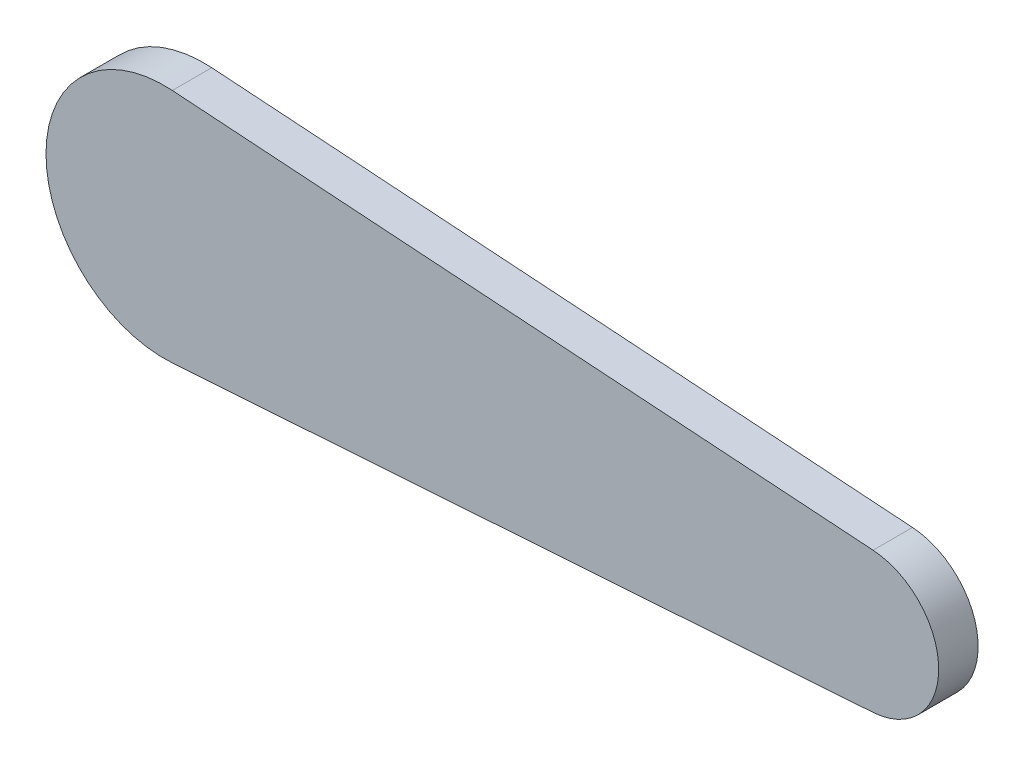
ISO-10303-21;
HEADER;
FILE_DESCRIPTION(('STEP AP214'),'2;1');
FILE_NAME('part.step','',(''),(''),'','','');
FILE_SCHEMA(('AUTOMOTIVE_DESIGN { 1 0 10303 214 1 1 1 1 }'));
ENDSEC;
DATA;
#1=APPLICATION_CONTEXT('core data for automotive mechanical design processes');
#2=APPLICATION_PROTOCOL_DEFINITION('international standard','automotive_design',2000,#1);
#3=PRODUCT_CONTEXT('',#1,'mechanical');
#4=PRODUCT('Part','Part','',(#3));
#5=PRODUCT_RELATED_PRODUCT_CATEGORY('part','',(#4));
#6=PRODUCT_DEFINITION_FORMATION('','',#4);
#7=PRODUCT_DEFINITION_CONTEXT('part definition',#1,'design');
#8=PRODUCT_DEFINITION('design','',#6,#7);
#9=PRODUCT_DEFINITION_SHAPE('','',#8);
#10=(LENGTH_UNIT() NAMED_UNIT(*) SI_UNIT(.MILLI.,.METRE.));
#11=(NAMED_UNIT(*) PLANE_ANGLE_UNIT() SI_UNIT($,.RADIAN.));
#12=(NAMED_UNIT(*) SI_UNIT($,.STERADIAN.) SOLID_ANGLE_UNIT());
#13=UNCERTAINTY_MEASURE_WITH_UNIT(LENGTH_MEASURE(1.E-05),#10,'distance_accuracy_value','');
#14=(GEOMETRIC_REPRESENTATION_CONTEXT(3) GLOBAL_UNCERTAINTY_ASSIGNED_CONTEXT((#13)) GLOBAL_UNIT_ASSIGNED_CONTEXT((#10,
#11,#12)) REPRESENTATION_CONTEXT('',''));
#15=CARTESIAN_POINT('',(0.,0.,0.));
#16=DIRECTION('',(0.,0.,1.));
#17=DIRECTION('',(1.,0.,0.));
#18=AXIS2_PLACEMENT_3D('',#15,#16,#17);
#19=CARTESIAN_POINT('',(0.,0.,7.));
#20=DIRECTION('',(0.,0.,-1.));
#21=DIRECTION('',(-1.,0.,0.));
#22=AXIS2_PLACEMENT_3D('',#19,#20,#21);
#23=CYLINDRICAL_SURFACE('',#22,21.);
#24=CARTESIAN_POINT('',(0.,0.,0.));
#25=DIRECTION('',(0.,0.,1.));
#26=DIRECTION('',(1.,0.,0.));
#27=AXIS2_PLACEMENT_3D('',#24,#25,#26);
#28=CIRCLE('',#27,21.);
#29=CARTESIAN_POINT('',(1.428,20.9513917437482,0.));
#30=VERTEX_POINT('',#29);
#31=CARTESIAN_POINT('',(1.428,-20.9513917437482,0.));
#32=VERTEX_POINT('',#31);
#33=EDGE_CURVE('E99',#30,#32,#28,.T.);
#34=ORIENTED_EDGE('',*,*,#33,.T.);
#35=DIRECTION('',(0.,0.,-1.));
#36=VECTOR('',#35,1.);
#37=CARTESIAN_POINT('',(1.428,-20.9513917437482,7.));
#38=LINE('',#37,#36);
#39=CARTESIAN_POINT('',(1.428,-20.9513917437482,7.));
#40=VERTEX_POINT('',#39);
#41=EDGE_CURVE('E11',#40,#32,#38,.T.);
#42=ORIENTED_EDGE('',*,*,#41,.F.);
#43=CARTESIAN_POINT('',(0.,0.,7.));
#44=DIRECTION('',(0.,0.,1.));
#45=DIRECTION('',(1.,0.,0.));
#46=AXIS2_PLACEMENT_3D('',#43,#44,#45);
#47=CIRCLE('',#46,21.);
#48=CARTESIAN_POINT('',(1.428,20.9513917437482,7.));
#49=VERTEX_POINT('',#48);
#50=EDGE_CURVE('E87',#49,#40,#47,.T.);
#51=ORIENTED_EDGE('',*,*,#50,.F.);
#52=DIRECTION('',(0.,0.,-1.));
#53=VECTOR('',#52,1.);
#54=CARTESIAN_POINT('',(1.428,20.9513917437482,7.));
#55=LINE('',#54,#53);
#56=EDGE_CURVE('E95',#49,#30,#55,.T.);
#57=ORIENTED_EDGE('',*,*,#56,.T.);
#58=EDGE_LOOP('',(#34,#42,#51,#57));
#59=FACE_BOUND('',#58,.T.);
#60=ADVANCED_FACE('F36',(#59),#23,.T.);
#61=CARTESIAN_POINT('',(1.428,-20.9513917437482,7.));
#62=DIRECTION('',(-0.068,0.997685321130866,0.));
#63=DIRECTION('',(-0.997685321130866,-0.068,0.));
#64=AXIS2_PLACEMENT_3D('',#61,#62,#63);
#65=PLANE('',#64);
#66=DIRECTION('',(0.997685321130866,0.068,0.));
#67=VECTOR('',#66,1.);
#68=CARTESIAN_POINT('',(1.428,-20.9513917437482,0.));
#69=LINE('',#68,#67);
#70=CARTESIAN_POINT('',(125.85,-12.4710665141358,0.));
#71=VERTEX_POINT('',#70);
#72=EDGE_CURVE('E91',#32,#71,#69,.T.);
#73=ORIENTED_EDGE('',*,*,#72,.T.);
#74=DIRECTION('',(0.,0.,-1.));
#75=VECTOR('',#74,1.);
#76=CARTESIAN_POINT('',(125.85,-12.4710665141358,7.));
#77=LINE('',#76,#75);
#78=CARTESIAN_POINT('',(125.85,-12.4710665141358,7.));
#79=VERTEX_POINT('',#78);
#80=EDGE_CURVE('E44',#79,#71,#77,.T.);
#81=ORIENTED_EDGE('',*,*,#80,.F.);
#82=DIRECTION('',(0.997685321130866,0.068,0.));
#83=VECTOR('',#82,1.);
#84=CARTESIAN_POINT('',(1.428,-20.9513917437482,7.));
#85=LINE('',#84,#83);
#86=EDGE_CURVE('E82',#40,#79,#85,.T.);
#87=ORIENTED_EDGE('',*,*,#86,.F.);
#88=ORIENTED_EDGE('',*,*,#41,.T.);
#89=EDGE_LOOP('',(#73,#81,#87,#88));
#90=FACE_BOUND('',#89,.T.);
#91=ADVANCED_FACE('F90',(#90),#65,.F.);
#92=CARTESIAN_POINT('',(125.,0.,7.));
#93=DIRECTION('',(0.,0.,-1.));
#94=DIRECTION('',(-1.,0.,0.));
#95=AXIS2_PLACEMENT_3D('',#92,#93,#94);
#96=CYLINDRICAL_SURFACE('',#95,12.5);
#97=CARTESIAN_POINT('',(125.,0.,0.));
#98=DIRECTION('',(0.,0.,1.));
#99=DIRECTION('',(1.,0.,0.));
#100=AXIS2_PLACEMENT_3D('',#97,#98,#99);
#101=CIRCLE('',#100,12.5);
#102=CARTESIAN_POINT('',(125.85,12.4710665141358,0.));
#103=VERTEX_POINT('',#102);
#104=EDGE_CURVE('E69',#71,#103,#101,.T.);
#105=ORIENTED_EDGE('',*,*,#104,.T.);
#106=DIRECTION('',(0.,0.,-1.));
#107=VECTOR('',#106,1.);
#108=CARTESIAN_POINT('',(125.85,12.4710665141358,7.));
#109=LINE('',#108,#107);
#110=CARTESIAN_POINT('',(125.85,12.4710665141358,7.));
#111=VERTEX_POINT('',#110);
#112=EDGE_CURVE('E92',#111,#103,#109,.T.);
#113=ORIENTED_EDGE('',*,*,#112,.F.);
#114=CARTESIAN_POINT('',(125.,0.,7.));
#115=DIRECTION('',(0.,0.,1.));
#116=DIRECTION('',(1.,0.,0.));
#117=AXIS2_PLACEMENT_3D('',#114,#115,#116);
#118=CIRCLE('',#117,12.5);
#119=EDGE_CURVE('E85',#79,#111,#118,.T.);
#120=ORIENTED_EDGE('',*,*,#119,.F.);
#121=ORIENTED_EDGE('',*,*,#80,.T.);
#122=EDGE_LOOP('',(#105,#113,#120,#121));
#123=FACE_BOUND('',#122,.T.);
#124=ADVANCED_FACE('F93',(#123),#96,.T.);
#125=CARTESIAN_POINT('',(1.428,20.9513917437482,7.));
#126=DIRECTION('',(-0.068,-0.997685321130866,0.));
#127=DIRECTION('',(0.997685321130866,-0.068,0.));
#128=AXIS2_PLACEMENT_3D('',#125,#126,#127);
#129=PLANE('',#128);
#130=DIRECTION('',(-0.997685321130866,0.068,0.));
#131=VECTOR('',#130,1.);
#132=CARTESIAN_POINT('',(1.428,20.9513917437482,0.));
#133=LINE('',#132,#131);
#134=EDGE_CURVE('E75',#103,#30,#133,.T.);
#135=ORIENTED_EDGE('',*,*,#134,.T.);
#136=ORIENTED_EDGE('',*,*,#56,.F.);
#137=DIRECTION('',(-0.997685321130866,0.068,0.));
#138=VECTOR('',#137,1.);
#139=CARTESIAN_POINT('',(1.428,20.9513917437482,7.));
#140=LINE('',#139,#138);
#141=EDGE_CURVE('E52',#111,#49,#140,.T.);
#142=ORIENTED_EDGE('',*,*,#141,.F.);
#143=ORIENTED_EDGE('',*,*,#112,.T.);
#144=EDGE_LOOP('',(#135,#136,#142,#143));
#145=FACE_BOUND('',#144,.T.);
#146=ADVANCED_FACE('F106',(#145),#129,.F.);
#147=CARTESIAN_POINT('',(0.,0.,7.));
#148=DIRECTION('',(0.,0.,1.));
#149=DIRECTION('',(1.,0.,0.));
#150=AXIS2_PLACEMENT_3D('',#147,#148,#149);
#151=PLANE('',#150);
#152=ORIENTED_EDGE('',*,*,#50,.T.);
#153=ORIENTED_EDGE('',*,*,#86,.T.);
#154=ORIENTED_EDGE('',*,*,#119,.T.);
#155=ORIENTED_EDGE('',*,*,#141,.T.);
#156=EDGE_LOOP('',(#152,#153,#154,#155));
#157=FACE_BOUND('',#156,.T.);
#158=ADVANCED_FACE('F83',(#157),#151,.T.);
#159=CARTESIAN_POINT('',(0.,0.,0.));
#160=DIRECTION('',(0.,0.,1.));
#161=DIRECTION('',(1.,0.,0.));
#162=AXIS2_PLACEMENT_3D('',#159,#160,#161);
#163=PLANE('',#162);
#164=ORIENTED_EDGE('',*,*,#33,.F.);
#165=ORIENTED_EDGE('',*,*,#134,.F.);
#166=ORIENTED_EDGE('',*,*,#104,.F.);
#167=ORIENTED_EDGE('',*,*,#72,.F.);
#168=EDGE_LOOP('',(#164,#165,#166,#167));
#169=FACE_BOUND('',#168,.T.);
#170=ADVANCED_FACE('F109',(#169),#163,.F.);
#171=CLOSED_SHELL('',(#60,#91,#124,#146,#158,#170));
#172=MANIFOLD_SOLID_BREP('B2',#171);
#173=ADVANCED_BREP_SHAPE_REPRESENTATION('',(#18,#172),#14);
#174=SHAPE_DEFINITION_REPRESENTATION(#9,#173);
ENDSEC;
END-ISO-10303-21;
